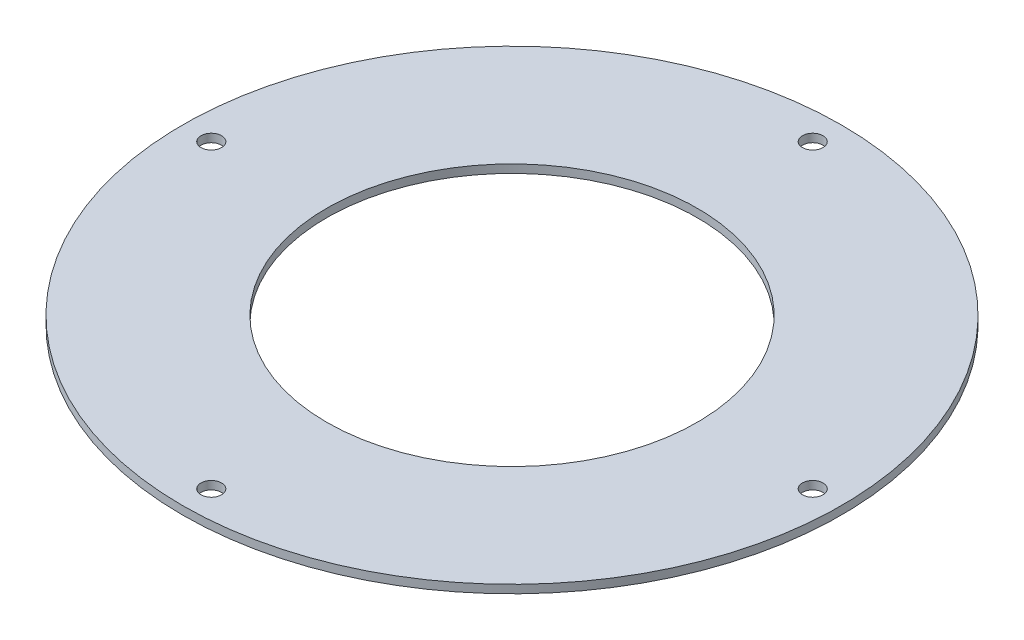
ISO-10303-21;
HEADER;
FILE_DESCRIPTION(('STEP AP214'),'2;1');
FILE_NAME('part.step','',(''),(''),'','','');
FILE_SCHEMA(('AUTOMOTIVE_DESIGN { 1 0 10303 214 1 1 1 1 }'));
ENDSEC;
DATA;
#1=APPLICATION_CONTEXT('core data for automotive mechanical design processes');
#2=APPLICATION_PROTOCOL_DEFINITION('international standard','automotive_design',2000,#1);
#3=PRODUCT_CONTEXT('',#1,'mechanical');
#4=PRODUCT('Part','Part','',(#3));
#5=PRODUCT_RELATED_PRODUCT_CATEGORY('part','',(#4));
#6=PRODUCT_DEFINITION_FORMATION('','',#4);
#7=PRODUCT_DEFINITION_CONTEXT('part definition',#1,'design');
#8=PRODUCT_DEFINITION('design','',#6,#7);
#9=PRODUCT_DEFINITION_SHAPE('','',#8);
#10=(LENGTH_UNIT() NAMED_UNIT(*) SI_UNIT(.MILLI.,.METRE.));
#11=(NAMED_UNIT(*) PLANE_ANGLE_UNIT() SI_UNIT($,.RADIAN.));
#12=(NAMED_UNIT(*) SI_UNIT($,.STERADIAN.) SOLID_ANGLE_UNIT());
#13=UNCERTAINTY_MEASURE_WITH_UNIT(LENGTH_MEASURE(1.E-05),#10,'distance_accuracy_value','');
#14=(GEOMETRIC_REPRESENTATION_CONTEXT(3) GLOBAL_UNCERTAINTY_ASSIGNED_CONTEXT((#13)) GLOBAL_UNIT_ASSIGNED_CONTEXT((#10,
#11,#12)) REPRESENTATION_CONTEXT('',''));
#15=CARTESIAN_POINT('',(0.,0.,0.));
#16=DIRECTION('',(0.,0.,1.));
#17=DIRECTION('',(1.,0.,0.));
#18=AXIS2_PLACEMENT_3D('',#15,#16,#17);
#19=CARTESIAN_POINT('',(0.,2.,0.));
#20=DIRECTION('',(0.,1.,0.));
#21=DIRECTION('',(0.,0.,1.));
#22=AXIS2_PLACEMENT_3D('',#19,#20,#21);
#23=PLANE('',#22);
#24=CARTESIAN_POINT('',(0.,2.,-73.));
#25=DIRECTION('',(0.,1.,0.));
#26=DIRECTION('',(0.,0.,1.));
#27=AXIS2_PLACEMENT_3D('',#24,#25,#26);
#28=CIRCLE('',#27,2.5);
#29=CARTESIAN_POINT('',(0.,2.,-70.5));
#30=VERTEX_POINT('',#29);
#31=EDGE_CURVE('E88',#30,#30,#28,.T.);
#32=ORIENTED_EDGE('',*,*,#31,.F.);
#33=EDGE_LOOP('',(#32));
#34=FACE_BOUND('',#33,.T.);
#35=CARTESIAN_POINT('',(73.,2.,0.));
#36=DIRECTION('',(0.,1.,0.));
#37=DIRECTION('',(0.,0.,1.));
#38=AXIS2_PLACEMENT_3D('',#35,#36,#37);
#39=CIRCLE('',#38,2.50000000000001);
#40=CARTESIAN_POINT('',(73.,2.,2.5));
#41=VERTEX_POINT('',#40);
#42=EDGE_CURVE('E84',#41,#41,#39,.T.);
#43=ORIENTED_EDGE('',*,*,#42,.F.);
#44=EDGE_LOOP('',(#43));
#45=FACE_BOUND('',#44,.T.);
#46=CARTESIAN_POINT('',(0.,2.,73.));
#47=DIRECTION('',(0.,1.,0.));
#48=DIRECTION('',(0.,0.,1.));
#49=AXIS2_PLACEMENT_3D('',#46,#47,#48);
#50=CIRCLE('',#49,2.5);
#51=CARTESIAN_POINT('',(0.,2.,75.5));
#52=VERTEX_POINT('',#51);
#53=EDGE_CURVE('E76',#52,#52,#50,.T.);
#54=ORIENTED_EDGE('',*,*,#53,.F.);
#55=EDGE_LOOP('',(#54));
#56=FACE_BOUND('',#55,.T.);
#57=CARTESIAN_POINT('',(-73.,2.,0.));
#58=DIRECTION('',(0.,1.,0.));
#59=DIRECTION('',(0.,0.,1.));
#60=AXIS2_PLACEMENT_3D('',#57,#58,#59);
#61=CIRCLE('',#60,2.50000000000001);
#62=CARTESIAN_POINT('',(-73.,2.,2.50000000000002));
#63=VERTEX_POINT('',#62);
#64=EDGE_CURVE('E68',#63,#63,#61,.T.);
#65=ORIENTED_EDGE('',*,*,#64,.F.);
#66=EDGE_LOOP('',(#65));
#67=FACE_BOUND('',#66,.T.);
#68=CARTESIAN_POINT('',(0.,2.,0.));
#69=DIRECTION('',(0.,1.,0.));
#70=DIRECTION('',(0.,0.,1.));
#71=AXIS2_PLACEMENT_3D('',#68,#69,#70);
#72=CIRCLE('',#71,80.);
#73=CARTESIAN_POINT('',(0.,2.,80.));
#74=VERTEX_POINT('',#73);
#75=EDGE_CURVE('E10',#74,#74,#72,.T.);
#76=ORIENTED_EDGE('',*,*,#75,.T.);
#77=EDGE_LOOP('',(#76));
#78=FACE_BOUND('',#77,.T.);
#79=CARTESIAN_POINT('',(0.,2.,0.));
#80=DIRECTION('',(0.,1.,0.));
#81=DIRECTION('',(0.,0.,1.));
#82=AXIS2_PLACEMENT_3D('',#79,#80,#81);
#83=CIRCLE('',#82,45.);
#84=CARTESIAN_POINT('',(0.,2.,45.));
#85=VERTEX_POINT('',#84);
#86=EDGE_CURVE('E54',#85,#85,#83,.T.);
#87=ORIENTED_EDGE('',*,*,#86,.F.);
#88=EDGE_LOOP('',(#87));
#89=FACE_BOUND('',#88,.T.);
#90=ADVANCED_FACE('F41',(#34,#45,#56,#67,#78,#89),#23,.T.);
#91=CARTESIAN_POINT('',(0.,0.,0.));
#92=DIRECTION('',(0.,1.,0.));
#93=DIRECTION('',(0.,0.,1.));
#94=AXIS2_PLACEMENT_3D('',#91,#92,#93);
#95=PLANE('',#94);
#96=CARTESIAN_POINT('',(0.,0.,-73.));
#97=DIRECTION('',(0.,1.,0.));
#98=DIRECTION('',(0.,0.,1.));
#99=AXIS2_PLACEMENT_3D('',#96,#97,#98);
#100=CIRCLE('',#99,2.5);
#101=CARTESIAN_POINT('',(0.,0.,-70.5));
#102=VERTEX_POINT('',#101);
#103=EDGE_CURVE('E60',#102,#102,#100,.T.);
#104=ORIENTED_EDGE('',*,*,#103,.T.);
#105=EDGE_LOOP('',(#104));
#106=FACE_BOUND('',#105,.T.);
#107=CARTESIAN_POINT('',(73.,0.,0.));
#108=DIRECTION('',(0.,1.,0.));
#109=DIRECTION('',(0.,0.,1.));
#110=AXIS2_PLACEMENT_3D('',#107,#108,#109);
#111=CIRCLE('',#110,2.50000000000001);
#112=CARTESIAN_POINT('',(73.,0.,2.5));
#113=VERTEX_POINT('',#112);
#114=EDGE_CURVE('E80',#113,#113,#111,.T.);
#115=ORIENTED_EDGE('',*,*,#114,.T.);
#116=EDGE_LOOP('',(#115));
#117=FACE_BOUND('',#116,.T.);
#118=CARTESIAN_POINT('',(0.,0.,73.));
#119=DIRECTION('',(0.,1.,0.));
#120=DIRECTION('',(0.,0.,1.));
#121=AXIS2_PLACEMENT_3D('',#118,#119,#120);
#122=CIRCLE('',#121,2.5);
#123=CARTESIAN_POINT('',(0.,0.,75.5));
#124=VERTEX_POINT('',#123);
#125=EDGE_CURVE('E72',#124,#124,#122,.T.);
#126=ORIENTED_EDGE('',*,*,#125,.T.);
#127=EDGE_LOOP('',(#126));
#128=FACE_BOUND('',#127,.T.);
#129=CARTESIAN_POINT('',(-73.,0.,0.));
#130=DIRECTION('',(0.,1.,0.));
#131=DIRECTION('',(0.,0.,1.));
#132=AXIS2_PLACEMENT_3D('',#129,#130,#131);
#133=CIRCLE('',#132,2.50000000000001);
#134=CARTESIAN_POINT('',(-73.,0.,2.50000000000002));
#135=VERTEX_POINT('',#134);
#136=EDGE_CURVE('E64',#135,#135,#133,.T.);
#137=ORIENTED_EDGE('',*,*,#136,.T.);
#138=EDGE_LOOP('',(#137));
#139=FACE_BOUND('',#138,.T.);
#140=CARTESIAN_POINT('',(0.,0.,0.));
#141=DIRECTION('',(0.,1.,0.));
#142=DIRECTION('',(0.,0.,1.));
#143=AXIS2_PLACEMENT_3D('',#140,#141,#142);
#144=CIRCLE('',#143,80.);
#145=CARTESIAN_POINT('',(0.,0.,80.));
#146=VERTEX_POINT('',#145);
#147=EDGE_CURVE('E45',#146,#146,#144,.T.);
#148=ORIENTED_EDGE('',*,*,#147,.F.);
#149=EDGE_LOOP('',(#148));
#150=FACE_BOUND('',#149,.T.);
#151=CARTESIAN_POINT('',(0.,0.,0.));
#152=DIRECTION('',(0.,1.,0.));
#153=DIRECTION('',(0.,0.,1.));
#154=AXIS2_PLACEMENT_3D('',#151,#152,#153);
#155=CIRCLE('',#154,45.);
#156=CARTESIAN_POINT('',(0.,0.,45.));
#157=VERTEX_POINT('',#156);
#158=EDGE_CURVE('E56',#157,#157,#155,.T.);
#159=ORIENTED_EDGE('',*,*,#158,.T.);
#160=EDGE_LOOP('',(#159));
#161=FACE_BOUND('',#160,.T.);
#162=ADVANCED_FACE('F96',(#106,#117,#128,#139,#150,#161),#95,.F.);
#163=CARTESIAN_POINT('',(0.,2.,0.));
#164=DIRECTION('',(0.,-1.,0.));
#165=DIRECTION('',(0.,0.,-1.));
#166=AXIS2_PLACEMENT_3D('',#163,#164,#165);
#167=CYLINDRICAL_SURFACE('',#166,80.);
#168=ORIENTED_EDGE('',*,*,#75,.F.);
#169=EDGE_LOOP('',(#168));
#170=FACE_BOUND('',#169,.T.);
#171=ORIENTED_EDGE('',*,*,#147,.T.);
#172=EDGE_LOOP('',(#171));
#173=FACE_BOUND('',#172,.T.);
#174=ADVANCED_FACE('F43',(#170,#173),#167,.T.);
#175=CARTESIAN_POINT('',(0.,2.,0.));
#176=DIRECTION('',(0.,-1.,0.));
#177=DIRECTION('',(0.,0.,-1.));
#178=AXIS2_PLACEMENT_3D('',#175,#176,#177);
#179=CYLINDRICAL_SURFACE('',#178,45.);
#180=ORIENTED_EDGE('',*,*,#86,.T.);
#181=EDGE_LOOP('',(#180));
#182=FACE_BOUND('',#181,.T.);
#183=ORIENTED_EDGE('',*,*,#158,.F.);
#184=EDGE_LOOP('',(#183));
#185=FACE_BOUND('',#184,.T.);
#186=ADVANCED_FACE('F117',(#182,#185),#179,.F.);
#187=CARTESIAN_POINT('',(-73.,0.,0.));
#188=DIRECTION('',(0.,1.,0.));
#189=DIRECTION('',(0.,0.,1.));
#190=AXIS2_PLACEMENT_3D('',#187,#188,#189);
#191=CYLINDRICAL_SURFACE('',#190,2.50000000000001);
#192=ORIENTED_EDGE('',*,*,#136,.F.);
#193=EDGE_LOOP('',(#192));
#194=FACE_BOUND('',#193,.T.);
#195=ORIENTED_EDGE('',*,*,#64,.T.);
#196=EDGE_LOOP('',(#195));
#197=FACE_BOUND('',#196,.T.);
#198=ADVANCED_FACE('F120',(#194,#197),#191,.F.);
#199=CARTESIAN_POINT('',(0.,0.,73.));
#200=DIRECTION('',(0.,1.,0.));
#201=DIRECTION('',(0.,0.,1.));
#202=AXIS2_PLACEMENT_3D('',#199,#200,#201);
#203=CYLINDRICAL_SURFACE('',#202,2.5);
#204=ORIENTED_EDGE('',*,*,#125,.F.);
#205=EDGE_LOOP('',(#204));
#206=FACE_BOUND('',#205,.T.);
#207=ORIENTED_EDGE('',*,*,#53,.T.);
#208=EDGE_LOOP('',(#207));
#209=FACE_BOUND('',#208,.T.);
#210=ADVANCED_FACE('F132',(#206,#209),#203,.F.);
#211=CARTESIAN_POINT('',(73.,0.,0.));
#212=DIRECTION('',(0.,1.,0.));
#213=DIRECTION('',(0.,0.,1.));
#214=AXIS2_PLACEMENT_3D('',#211,#212,#213);
#215=CYLINDRICAL_SURFACE('',#214,2.50000000000001);
#216=ORIENTED_EDGE('',*,*,#114,.F.);
#217=EDGE_LOOP('',(#216));
#218=FACE_BOUND('',#217,.T.);
#219=ORIENTED_EDGE('',*,*,#42,.T.);
#220=EDGE_LOOP('',(#219));
#221=FACE_BOUND('',#220,.T.);
#222=ADVANCED_FACE('F102',(#218,#221),#215,.F.);
#223=CARTESIAN_POINT('',(0.,0.,-73.));
#224=DIRECTION('',(0.,1.,0.));
#225=DIRECTION('',(0.,0.,1.));
#226=AXIS2_PLACEMENT_3D('',#223,#224,#225);
#227=CYLINDRICAL_SURFACE('',#226,2.5);
#228=ORIENTED_EDGE('',*,*,#103,.F.);
#229=EDGE_LOOP('',(#228));
#230=FACE_BOUND('',#229,.T.);
#231=ORIENTED_EDGE('',*,*,#31,.T.);
#232=EDGE_LOOP('',(#231));
#233=FACE_BOUND('',#232,.T.);
#234=ADVANCED_FACE('F99',(#230,#233),#227,.F.);
#235=CLOSED_SHELL('',(#90,#162,#174,#186,#198,#210,#222,#234));
#236=MANIFOLD_SOLID_BREP('B2',#235);
#237=ADVANCED_BREP_SHAPE_REPRESENTATION('',(#18,#236),#14);
#238=SHAPE_DEFINITION_REPRESENTATION(#9,#237);
ENDSEC;
END-ISO-10303-21;
